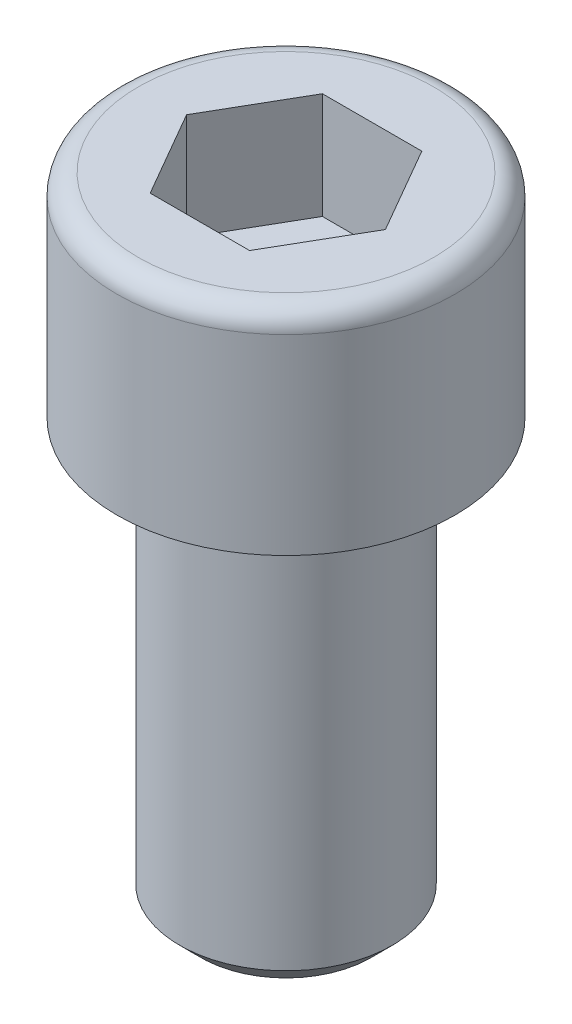
ISO-10303-21;
HEADER;
FILE_DESCRIPTION(('STEP AP214'),'2;1');
FILE_NAME('part.step','',(''),(''),'','','');
FILE_SCHEMA(('AUTOMOTIVE_DESIGN { 1 0 10303 214 1 1 1 1 }'));
ENDSEC;
DATA;
#1=APPLICATION_CONTEXT('core data for automotive mechanical design processes');
#2=APPLICATION_PROTOCOL_DEFINITION('international standard','automotive_design',2000,#1);
#3=PRODUCT_CONTEXT('',#1,'mechanical');
#4=PRODUCT('Part','Part','',(#3));
#5=PRODUCT_RELATED_PRODUCT_CATEGORY('part','',(#4));
#6=PRODUCT_DEFINITION_FORMATION('','',#4);
#7=PRODUCT_DEFINITION_CONTEXT('part definition',#1,'design');
#8=PRODUCT_DEFINITION('design','',#6,#7);
#9=PRODUCT_DEFINITION_SHAPE('','',#8);
#10=(LENGTH_UNIT() NAMED_UNIT(*) SI_UNIT(.MILLI.,.METRE.));
#11=(NAMED_UNIT(*) PLANE_ANGLE_UNIT() SI_UNIT($,.RADIAN.));
#12=(NAMED_UNIT(*) SI_UNIT($,.STERADIAN.) SOLID_ANGLE_UNIT());
#13=UNCERTAINTY_MEASURE_WITH_UNIT(LENGTH_MEASURE(1.E-05),#10,'distance_accuracy_value','');
#14=(GEOMETRIC_REPRESENTATION_CONTEXT(3) GLOBAL_UNCERTAINTY_ASSIGNED_CONTEXT((#13)) GLOBAL_UNIT_ASSIGNED_CONTEXT((#10,
#11,#12)) REPRESENTATION_CONTEXT('',''));
#15=CARTESIAN_POINT('',(0.,0.,0.));
#16=DIRECTION('',(0.,0.,1.));
#17=DIRECTION('',(1.,0.,0.));
#18=AXIS2_PLACEMENT_3D('',#15,#16,#17);
#19=CARTESIAN_POINT('',(0.,0.,0.));
#20=DIRECTION('',(0.,-1.,0.));
#21=DIRECTION('',(0.,0.,-1.));
#22=AXIS2_PLACEMENT_3D('',#19,#20,#21);
#23=PLANE('',#22);
#24=CARTESIAN_POINT('',(0.,0.,0.));
#25=DIRECTION('',(0.,-1.,0.));
#26=DIRECTION('',(0.,0.,-1.));
#27=AXIS2_PLACEMENT_3D('',#24,#25,#26);
#28=CIRCLE('',#27,7.95);
#29=CARTESIAN_POINT('',(0.,0.,-7.95));
#30=VERTEX_POINT('',#29);
#31=EDGE_CURVE('E142',#30,#30,#28,.T.);
#32=ORIENTED_EDGE('',*,*,#31,.T.);
#33=EDGE_LOOP('',(#32));
#34=FACE_BOUND('',#33,.T.);
#35=CARTESIAN_POINT('',(0.,0.,0.));
#36=DIRECTION('',(0.,-1.,0.));
#37=DIRECTION('',(0.,0.,-1.));
#38=AXIS2_PLACEMENT_3D('',#35,#36,#37);
#39=CIRCLE('',#38,5.);
#40=CARTESIAN_POINT('',(0.,0.,-5.));
#41=VERTEX_POINT('',#40);
#42=EDGE_CURVE('E134',#41,#41,#39,.T.);
#43=ORIENTED_EDGE('',*,*,#42,.F.);
#44=EDGE_LOOP('',(#43));
#45=FACE_BOUND('',#44,.T.);
#46=ADVANCED_FACE('F32',(#34,#45),#23,.T.);
#47=CARTESIAN_POINT('',(0.,10.,0.));
#48=DIRECTION('',(0.,-1.,0.));
#49=DIRECTION('',(0.,0.,-1.));
#50=AXIS2_PLACEMENT_3D('',#47,#48,#49);
#51=CYLINDRICAL_SURFACE('',#50,7.95);
#52=CARTESIAN_POINT('',(0.,9.,0.));
#53=DIRECTION('',(0.,1.,0.));
#54=DIRECTION('',(0.,0.,1.));
#55=AXIS2_PLACEMENT_3D('',#52,#53,#54);
#56=CIRCLE('',#55,7.95);
#57=CARTESIAN_POINT('',(0.,9.,7.95));
#58=VERTEX_POINT('',#57);
#59=EDGE_CURVE('E40',#58,#58,#56,.F.);
#60=ORIENTED_EDGE('',*,*,#59,.T.);
#61=EDGE_LOOP('',(#60));
#62=FACE_BOUND('',#61,.T.);
#63=ORIENTED_EDGE('',*,*,#31,.F.);
#64=EDGE_LOOP('',(#63));
#65=FACE_BOUND('',#64,.T.);
#66=ADVANCED_FACE('F153',(#62,#65),#51,.T.);
#67=CARTESIAN_POINT('',(7.95,10.,0.));
#68=DIRECTION('',(0.,1.,0.));
#69=DIRECTION('',(0.,0.,1.));
#70=AXIS2_PLACEMENT_3D('',#67,#68,#69);
#71=PLANE('',#70);
#72=CARTESIAN_POINT('',(0.,10.,0.));
#73=DIRECTION('',(0.,1.,0.));
#74=DIRECTION('',(0.,0.,1.));
#75=AXIS2_PLACEMENT_3D('',#72,#73,#74);
#76=CIRCLE('',#75,6.95);
#77=CARTESIAN_POINT('',(0.,10.,6.95));
#78=VERTEX_POINT('',#77);
#79=EDGE_CURVE('E11',#78,#78,#76,.T.);
#80=ORIENTED_EDGE('',*,*,#79,.T.);
#81=EDGE_LOOP('',(#80));
#82=FACE_BOUND('',#81,.T.);
#83=DIRECTION('',(0.5,0.,0.866025403784439));
#84=VECTOR('',#83,1.);
#85=CARTESIAN_POINT('',(-4.67653718043597,10.,0.));
#86=LINE('',#85,#84);
#87=CARTESIAN_POINT('',(-4.67653718043597,10.,0.));
#88=VERTEX_POINT('',#87);
#89=CARTESIAN_POINT('',(-2.33826859021798,10.,4.05));
#90=VERTEX_POINT('',#89);
#91=EDGE_CURVE('E47',#88,#90,#86,.T.);
#92=ORIENTED_EDGE('',*,*,#91,.F.);
#93=DIRECTION('',(-0.5,0.,0.866025403784439));
#94=VECTOR('',#93,1.);
#95=CARTESIAN_POINT('',(-2.33826859021798,10.,-4.05));
#96=LINE('',#95,#94);
#97=CARTESIAN_POINT('',(-2.33826859021798,10.,-4.05));
#98=VERTEX_POINT('',#97);
#99=EDGE_CURVE('E130',#98,#88,#96,.T.);
#100=ORIENTED_EDGE('',*,*,#99,.F.);
#101=DIRECTION('',(-1.,0.,0.));
#102=VECTOR('',#101,1.);
#103=CARTESIAN_POINT('',(2.33826859021798,10.,-4.05));
#104=LINE('',#103,#102);
#105=CARTESIAN_POINT('',(2.33826859021798,10.,-4.05));
#106=VERTEX_POINT('',#105);
#107=EDGE_CURVE('E128',#106,#98,#104,.T.);
#108=ORIENTED_EDGE('',*,*,#107,.F.);
#109=DIRECTION('',(-0.5,0.,-0.866025403784438));
#110=VECTOR('',#109,1.);
#111=CARTESIAN_POINT('',(4.67653718043597,10.,0.));
#112=LINE('',#111,#110);
#113=CARTESIAN_POINT('',(4.67653718043597,10.,0.));
#114=VERTEX_POINT('',#113);
#115=EDGE_CURVE('E95',#114,#106,#112,.T.);
#116=ORIENTED_EDGE('',*,*,#115,.F.);
#117=DIRECTION('',(0.5,0.,-0.866025403784439));
#118=VECTOR('',#117,1.);
#119=CARTESIAN_POINT('',(2.33826859021798,10.,4.05));
#120=LINE('',#119,#118);
#121=CARTESIAN_POINT('',(2.33826859021798,10.,4.05));
#122=VERTEX_POINT('',#121);
#123=EDGE_CURVE('E124',#122,#114,#120,.T.);
#124=ORIENTED_EDGE('',*,*,#123,.F.);
#125=DIRECTION('',(1.,0.,0.));
#126=VECTOR('',#125,1.);
#127=CARTESIAN_POINT('',(-2.33826859021798,10.,4.05));
#128=LINE('',#127,#126);
#129=EDGE_CURVE('E121',#90,#122,#128,.T.);
#130=ORIENTED_EDGE('',*,*,#129,.F.);
#131=EDGE_LOOP('',(#92,#100,#108,#116,#124,#130));
#132=FACE_BOUND('',#131,.T.);
#133=ADVANCED_FACE('F170',(#82,#132),#71,.T.);
#134=CARTESIAN_POINT('',(0.,-20.,0.));
#135=DIRECTION('',(0.,1.,0.));
#136=DIRECTION('',(0.,0.,1.));
#137=AXIS2_PLACEMENT_3D('',#134,#135,#136);
#138=CYLINDRICAL_SURFACE('',#137,5.);
#139=CARTESIAN_POINT('',(0.,-19.,0.));
#140=DIRECTION('',(0.,-1.,0.));
#141=DIRECTION('',(0.,0.,-1.));
#142=AXIS2_PLACEMENT_3D('',#139,#140,#141);
#143=CIRCLE('',#142,5.);
#144=CARTESIAN_POINT('',(0.,-19.,-5.));
#145=VERTEX_POINT('',#144);
#146=EDGE_CURVE('E148',#145,#145,#143,.F.);
#147=ORIENTED_EDGE('',*,*,#146,.T.);
#148=EDGE_LOOP('',(#147));
#149=FACE_BOUND('',#148,.T.);
#150=ORIENTED_EDGE('',*,*,#42,.T.);
#151=EDGE_LOOP('',(#150));
#152=FACE_BOUND('',#151,.T.);
#153=ADVANCED_FACE('F175',(#149,#152),#138,.T.);
#154=CARTESIAN_POINT('',(0.,-20.,0.));
#155=DIRECTION('',(0.,-1.,0.));
#156=DIRECTION('',(0.,0.,-1.));
#157=AXIS2_PLACEMENT_3D('',#154,#155,#156);
#158=PLANE('',#157);
#159=CARTESIAN_POINT('',(0.,-20.,0.));
#160=DIRECTION('',(0.,-1.,0.));
#161=DIRECTION('',(0.,0.,-1.));
#162=AXIS2_PLACEMENT_3D('',#159,#160,#161);
#163=CIRCLE('',#162,4.00000000000001);
#164=CARTESIAN_POINT('',(0.,-20.,-4.00000000000001));
#165=VERTEX_POINT('',#164);
#166=EDGE_CURVE('E145',#165,#165,#163,.T.);
#167=ORIENTED_EDGE('',*,*,#166,.T.);
#168=EDGE_LOOP('',(#167));
#169=FACE_BOUND('',#168,.T.);
#170=ADVANCED_FACE('F182',(#169),#158,.T.);
#171=CARTESIAN_POINT('',(-4.67653718043597,5.,0.));
#172=DIRECTION('',(-0.866025403784439,0.,0.5));
#173=DIRECTION('',(0.5,0.,0.866025403784439));
#174=AXIS2_PLACEMENT_3D('',#171,#172,#173);
#175=PLANE('',#174);
#176=ORIENTED_EDGE('',*,*,#91,.T.);
#177=DIRECTION('',(0.,1.,0.));
#178=VECTOR('',#177,1.);
#179=CARTESIAN_POINT('',(-2.33826859021798,5.,4.05));
#180=LINE('',#179,#178);
#181=CARTESIAN_POINT('',(-2.33826859021798,5.,4.05));
#182=VERTEX_POINT('',#181);
#183=EDGE_CURVE('E77',#182,#90,#180,.T.);
#184=ORIENTED_EDGE('',*,*,#183,.F.);
#185=DIRECTION('',(0.5,0.,0.866025403784439));
#186=VECTOR('',#185,1.);
#187=CARTESIAN_POINT('',(-4.67653718043597,5.,0.));
#188=LINE('',#187,#186);
#189=CARTESIAN_POINT('',(-4.67653718043597,5.,0.));
#190=VERTEX_POINT('',#189);
#191=EDGE_CURVE('E132',#190,#182,#188,.T.);
#192=ORIENTED_EDGE('',*,*,#191,.F.);
#193=DIRECTION('',(0.,1.,0.));
#194=VECTOR('',#193,1.);
#195=CARTESIAN_POINT('',(-4.67653718043597,5.,0.));
#196=LINE('',#195,#194);
#197=EDGE_CURVE('E55',#190,#88,#196,.T.);
#198=ORIENTED_EDGE('',*,*,#197,.T.);
#199=EDGE_LOOP('',(#176,#184,#192,#198));
#200=FACE_BOUND('',#199,.T.);
#201=ADVANCED_FACE('F191',(#200),#175,.F.);
#202=CARTESIAN_POINT('',(-2.33826859021798,5.,-4.05));
#203=DIRECTION('',(-0.866025403784439,0.,-0.5));
#204=DIRECTION('',(-0.5,0.,0.866025403784439));
#205=AXIS2_PLACEMENT_3D('',#202,#203,#204);
#206=PLANE('',#205);
#207=ORIENTED_EDGE('',*,*,#99,.T.);
#208=ORIENTED_EDGE('',*,*,#197,.F.);
#209=DIRECTION('',(-0.5,0.,0.866025403784439));
#210=VECTOR('',#209,1.);
#211=CARTESIAN_POINT('',(-2.33826859021798,5.,-4.05));
#212=LINE('',#211,#210);
#213=CARTESIAN_POINT('',(-2.33826859021798,5.,-4.05));
#214=VERTEX_POINT('',#213);
#215=EDGE_CURVE('E107',#214,#190,#212,.T.);
#216=ORIENTED_EDGE('',*,*,#215,.F.);
#217=DIRECTION('',(0.,1.,0.));
#218=VECTOR('',#217,1.);
#219=CARTESIAN_POINT('',(-2.33826859021798,5.,-4.05));
#220=LINE('',#219,#218);
#221=EDGE_CURVE('E99',#214,#98,#220,.T.);
#222=ORIENTED_EDGE('',*,*,#221,.T.);
#223=EDGE_LOOP('',(#207,#208,#216,#222));
#224=FACE_BOUND('',#223,.T.);
#225=ADVANCED_FACE('F193',(#224),#206,.F.);
#226=CARTESIAN_POINT('',(2.33826859021798,5.,-4.05));
#227=DIRECTION('',(0.,0.,-1.));
#228=DIRECTION('',(-1.,0.,0.));
#229=AXIS2_PLACEMENT_3D('',#226,#227,#228);
#230=PLANE('',#229);
#231=ORIENTED_EDGE('',*,*,#107,.T.);
#232=ORIENTED_EDGE('',*,*,#221,.F.);
#233=DIRECTION('',(-1.,0.,0.));
#234=VECTOR('',#233,1.);
#235=CARTESIAN_POINT('',(2.33826859021798,5.,-4.05));
#236=LINE('',#235,#234);
#237=CARTESIAN_POINT('',(2.33826859021798,5.,-4.05));
#238=VERTEX_POINT('',#237);
#239=EDGE_CURVE('E103',#238,#214,#236,.T.);
#240=ORIENTED_EDGE('',*,*,#239,.F.);
#241=DIRECTION('',(0.,1.,0.));
#242=VECTOR('',#241,1.);
#243=CARTESIAN_POINT('',(2.33826859021798,5.,-4.05));
#244=LINE('',#243,#242);
#245=EDGE_CURVE('E88',#238,#106,#244,.T.);
#246=ORIENTED_EDGE('',*,*,#245,.T.);
#247=EDGE_LOOP('',(#231,#232,#240,#246));
#248=FACE_BOUND('',#247,.T.);
#249=ADVANCED_FACE('F104',(#248),#230,.F.);
#250=CARTESIAN_POINT('',(4.67653718043597,5.,0.));
#251=DIRECTION('',(0.866025403784439,0.,-0.5));
#252=DIRECTION('',(-0.5,0.,-0.866025403784439));
#253=AXIS2_PLACEMENT_3D('',#250,#251,#252);
#254=PLANE('',#253);
#255=ORIENTED_EDGE('',*,*,#115,.T.);
#256=ORIENTED_EDGE('',*,*,#245,.F.);
#257=DIRECTION('',(-0.5,0.,-0.866025403784438));
#258=VECTOR('',#257,1.);
#259=CARTESIAN_POINT('',(4.67653718043597,5.,0.));
#260=LINE('',#259,#258);
#261=CARTESIAN_POINT('',(4.67653718043597,5.,0.));
#262=VERTEX_POINT('',#261);
#263=EDGE_CURVE('E92',#262,#238,#260,.T.);
#264=ORIENTED_EDGE('',*,*,#263,.F.);
#265=DIRECTION('',(0.,1.,0.));
#266=VECTOR('',#265,1.);
#267=CARTESIAN_POINT('',(4.67653718043597,5.,0.));
#268=LINE('',#267,#266);
#269=EDGE_CURVE('E100',#262,#114,#268,.T.);
#270=ORIENTED_EDGE('',*,*,#269,.T.);
#271=EDGE_LOOP('',(#255,#256,#264,#270));
#272=FACE_BOUND('',#271,.T.);
#273=ADVANCED_FACE('F90',(#272),#254,.F.);
#274=CARTESIAN_POINT('',(2.33826859021798,5.,4.05));
#275=DIRECTION('',(0.866025403784439,0.,0.5));
#276=DIRECTION('',(0.5,0.,-0.866025403784439));
#277=AXIS2_PLACEMENT_3D('',#274,#275,#276);
#278=PLANE('',#277);
#279=ORIENTED_EDGE('',*,*,#123,.T.);
#280=ORIENTED_EDGE('',*,*,#269,.F.);
#281=DIRECTION('',(0.5,0.,-0.866025403784439));
#282=VECTOR('',#281,1.);
#283=CARTESIAN_POINT('',(2.33826859021798,5.,4.05));
#284=LINE('',#283,#282);
#285=CARTESIAN_POINT('',(2.33826859021798,5.,4.05));
#286=VERTEX_POINT('',#285);
#287=EDGE_CURVE('E113',#286,#262,#284,.T.);
#288=ORIENTED_EDGE('',*,*,#287,.F.);
#289=DIRECTION('',(0.,1.,0.));
#290=VECTOR('',#289,1.);
#291=CARTESIAN_POINT('',(2.33826859021798,5.,4.05));
#292=LINE('',#291,#290);
#293=EDGE_CURVE('E137',#286,#122,#292,.T.);
#294=ORIENTED_EDGE('',*,*,#293,.T.);
#295=EDGE_LOOP('',(#279,#280,#288,#294));
#296=FACE_BOUND('',#295,.T.);
#297=ADVANCED_FACE('F204',(#296),#278,.F.);
#298=CARTESIAN_POINT('',(-2.33826859021798,5.,4.05));
#299=DIRECTION('',(0.,0.,1.));
#300=DIRECTION('',(1.,0.,0.));
#301=AXIS2_PLACEMENT_3D('',#298,#299,#300);
#302=PLANE('',#301);
#303=ORIENTED_EDGE('',*,*,#129,.T.);
#304=ORIENTED_EDGE('',*,*,#293,.F.);
#305=DIRECTION('',(1.,0.,0.));
#306=VECTOR('',#305,1.);
#307=CARTESIAN_POINT('',(-2.33826859021798,5.,4.05));
#308=LINE('',#307,#306);
#309=EDGE_CURVE('E115',#182,#286,#308,.T.);
#310=ORIENTED_EDGE('',*,*,#309,.F.);
#311=ORIENTED_EDGE('',*,*,#183,.T.);
#312=EDGE_LOOP('',(#303,#304,#310,#311));
#313=FACE_BOUND('',#312,.T.);
#314=ADVANCED_FACE('F189',(#313),#302,.F.);
#315=CARTESIAN_POINT('',(0.,5.,0.));
#316=DIRECTION('',(0.,1.,0.));
#317=DIRECTION('',(0.,0.,1.));
#318=AXIS2_PLACEMENT_3D('',#315,#316,#317);
#319=PLANE('',#318);
#320=ORIENTED_EDGE('',*,*,#191,.T.);
#321=ORIENTED_EDGE('',*,*,#309,.T.);
#322=ORIENTED_EDGE('',*,*,#287,.T.);
#323=ORIENTED_EDGE('',*,*,#263,.T.);
#324=ORIENTED_EDGE('',*,*,#239,.T.);
#325=ORIENTED_EDGE('',*,*,#215,.T.);
#326=EDGE_LOOP('',(#320,#321,#322,#323,#324,#325));
#327=FACE_BOUND('',#326,.T.);
#328=ADVANCED_FACE('F110',(#327),#319,.T.);
#329=CARTESIAN_POINT('',(0.,-20.,0.));
#330=DIRECTION('',(0.,1.,0.));
#331=DIRECTION('',(0.,0.,1.));
#332=AXIS2_PLACEMENT_3D('',#329,#330,#331);
#333=CONICAL_SURFACE('',#332,4.00000000000001,0.785398163397446);
#334=ORIENTED_EDGE('',*,*,#146,.F.);
#335=EDGE_LOOP('',(#334));
#336=FACE_BOUND('',#335,.T.);
#337=ORIENTED_EDGE('',*,*,#166,.F.);
#338=EDGE_LOOP('',(#337));
#339=FACE_BOUND('',#338,.T.);
#340=ADVANCED_FACE('F157',(#336,#339),#333,.T.);
#341=CARTESIAN_POINT('',(0.,9.,0.));
#342=DIRECTION('',(0.,1.,0.));
#343=DIRECTION('',(0.,0.,1.));
#344=AXIS2_PLACEMENT_3D('',#341,#342,#343);
#345=TOROIDAL_SURFACE('',#344,6.95,1.);
#346=ORIENTED_EDGE('',*,*,#79,.F.);
#347=EDGE_LOOP('',(#346));
#348=FACE_BOUND('',#347,.T.);
#349=ORIENTED_EDGE('',*,*,#59,.F.);
#350=EDGE_LOOP('',(#349));
#351=FACE_BOUND('',#350,.T.);
#352=ADVANCED_FACE('F34',(#348,#351),#345,.T.);
#353=CLOSED_SHELL('',(#46,#66,#133,#153,#170,#201,#225,#249,#273,#297,#314,#328,#340,#352));
#354=MANIFOLD_SOLID_BREP('B2',#353);
#355=ADVANCED_BREP_SHAPE_REPRESENTATION('',(#18,#354),#14);
#356=SHAPE_DEFINITION_REPRESENTATION(#9,#355);
ENDSEC;
END-ISO-10303-21;
